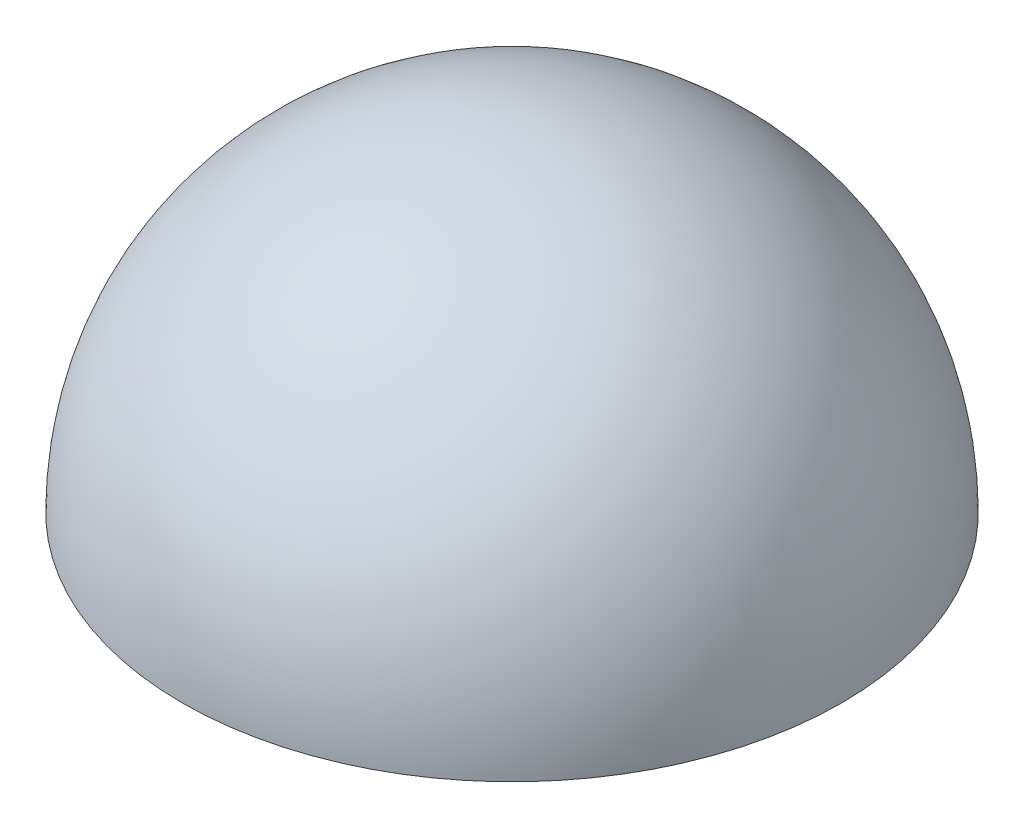
ISO-10303-21;
HEADER;
FILE_DESCRIPTION(('STEP AP214'),'2;1');
FILE_NAME('part.step','',(''),(''),'','','');
FILE_SCHEMA(('AUTOMOTIVE_DESIGN { 1 0 10303 214 1 1 1 1 }'));
ENDSEC;
DATA;
#1=APPLICATION_CONTEXT('core data for automotive mechanical design processes');
#2=APPLICATION_PROTOCOL_DEFINITION('international standard','automotive_design',2000,#1);
#3=PRODUCT_CONTEXT('',#1,'mechanical');
#4=PRODUCT('Part','Part','',(#3));
#5=PRODUCT_RELATED_PRODUCT_CATEGORY('part','',(#4));
#6=PRODUCT_DEFINITION_FORMATION('','',#4);
#7=PRODUCT_DEFINITION_CONTEXT('part definition',#1,'design');
#8=PRODUCT_DEFINITION('design','',#6,#7);
#9=PRODUCT_DEFINITION_SHAPE('','',#8);
#10=(LENGTH_UNIT() NAMED_UNIT(*) SI_UNIT(.MILLI.,.METRE.));
#11=(NAMED_UNIT(*) PLANE_ANGLE_UNIT() SI_UNIT($,.RADIAN.));
#12=(NAMED_UNIT(*) SI_UNIT($,.STERADIAN.) SOLID_ANGLE_UNIT());
#13=UNCERTAINTY_MEASURE_WITH_UNIT(LENGTH_MEASURE(1.E-05),#10,'distance_accuracy_value','');
#14=(GEOMETRIC_REPRESENTATION_CONTEXT(3) GLOBAL_UNCERTAINTY_ASSIGNED_CONTEXT((#13)) GLOBAL_UNIT_ASSIGNED_CONTEXT((#10,
#11,#12)) REPRESENTATION_CONTEXT('',''));
#15=CARTESIAN_POINT('',(0.,0.,0.));
#16=DIRECTION('',(0.,0.,1.));
#17=DIRECTION('',(1.,0.,0.));
#18=AXIS2_PLACEMENT_3D('',#15,#16,#17);
#19=CARTESIAN_POINT('',(0.,0.,0.));
#20=DIRECTION('',(0.,-1.,0.));
#21=DIRECTION('',(-1.,0.,0.));
#22=AXIS2_PLACEMENT_3D('',#19,#20,#21);
#23=SPHERICAL_SURFACE('',#22,25.);
#24=CARTESIAN_POINT('',(0.,0.,0.));
#25=DIRECTION('',(0.,-1.,0.));
#26=DIRECTION('',(1.,0.,0.));
#27=AXIS2_PLACEMENT_3D('',#24,#25,#26);
#28=CIRCLE('',#27,25.);
#29=CARTESIAN_POINT('',(25.,0.,0.));
#30=VERTEX_POINT('',#29);
#31=EDGE_CURVE('E10',#30,#30,#28,.T.);
#32=ORIENTED_EDGE('',*,*,#31,.F.);
#33=EDGE_LOOP('',(#32));
#34=FACE_BOUND('',#33,.T.);
#35=ADVANCED_FACE('F34',(#34),#23,.T.);
#36=CARTESIAN_POINT('',(-25.,0.,0.));
#37=DIRECTION('',(0.,1.,0.));
#38=DIRECTION('',(-1.,0.,0.));
#39=AXIS2_PLACEMENT_3D('',#36,#37,#38);
#40=PLANE('',#39);
#41=CARTESIAN_POINT('',(0.,0.,0.));
#42=DIRECTION('',(0.,1.,0.));
#43=DIRECTION('',(-1.,0.,0.));
#44=AXIS2_PLACEMENT_3D('',#41,#42,#43);
#45=CIRCLE('',#44,20.);
#46=CARTESIAN_POINT('',(-20.,0.,0.));
#47=VERTEX_POINT('',#46);
#48=EDGE_CURVE('E40',#47,#47,#45,.F.);
#49=ORIENTED_EDGE('',*,*,#48,.F.);
#50=EDGE_LOOP('',(#49));
#51=FACE_BOUND('',#50,.T.);
#52=ORIENTED_EDGE('',*,*,#31,.T.);
#53=EDGE_LOOP('',(#52));
#54=FACE_BOUND('',#53,.T.);
#55=ADVANCED_FACE('F48',(#51,#54),#40,.F.);
#56=CARTESIAN_POINT('',(0.,0.,0.));
#57=DIRECTION('',(0.,-1.,0.));
#58=DIRECTION('',(-1.,0.,0.));
#59=AXIS2_PLACEMENT_3D('',#56,#57,#58);
#60=SPHERICAL_SURFACE('',#59,20.);
#61=ORIENTED_EDGE('',*,*,#48,.T.);
#62=EDGE_LOOP('',(#61));
#63=FACE_BOUND('',#62,.T.);
#64=ADVANCED_FACE('F46',(#63),#60,.F.);
#65=CLOSED_SHELL('',(#35,#55,#64));
#66=MANIFOLD_SOLID_BREP('B2',#65);
#67=ADVANCED_BREP_SHAPE_REPRESENTATION('',(#18,#66),#14);
#68=SHAPE_DEFINITION_REPRESENTATION(#9,#67);
ENDSEC;
END-ISO-10303-21;
